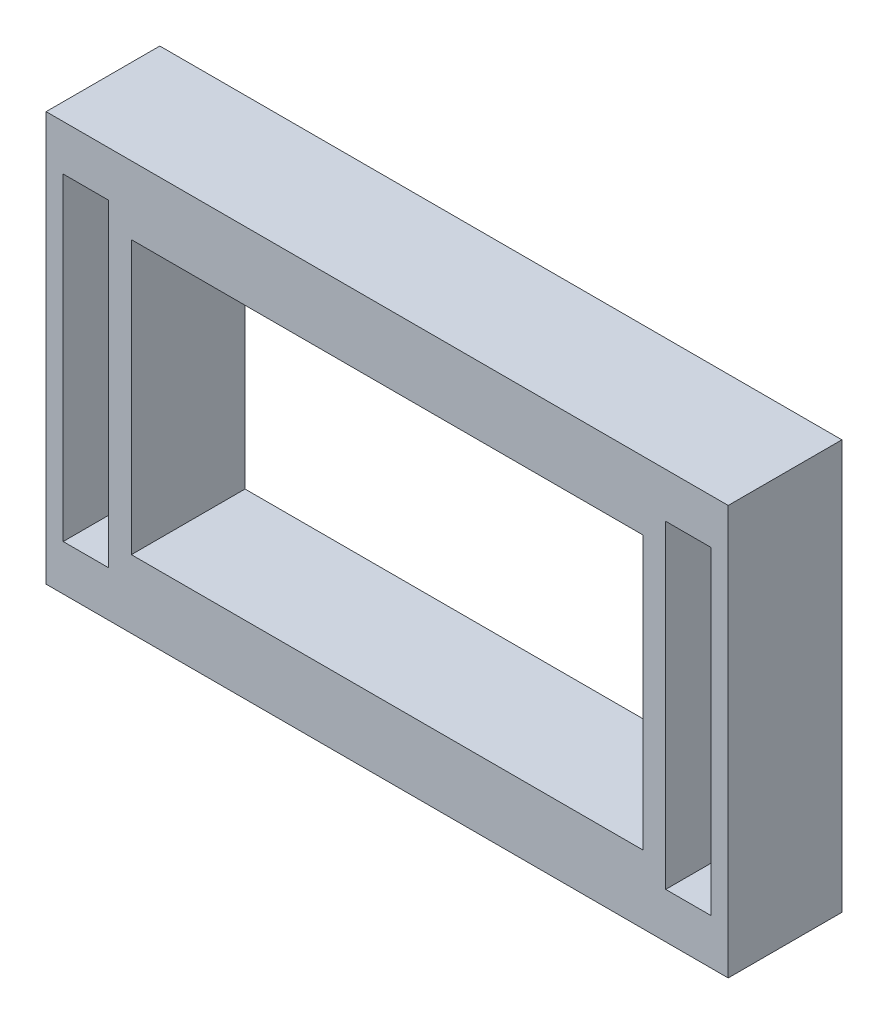
ISO-10303-21;
HEADER;
FILE_DESCRIPTION(('STEP AP214'),'2;1');
FILE_NAME('part.step','',(''),(''),'','','');
FILE_SCHEMA(('AUTOMOTIVE_DESIGN { 1 0 10303 214 1 1 1 1 }'));
ENDSEC;
DATA;
#1=APPLICATION_CONTEXT('core data for automotive mechanical design processes');
#2=APPLICATION_PROTOCOL_DEFINITION('international standard','automotive_design',2000,#1);
#3=PRODUCT_CONTEXT('',#1,'mechanical');
#4=PRODUCT('Part','Part','',(#3));
#5=PRODUCT_RELATED_PRODUCT_CATEGORY('part','',(#4));
#6=PRODUCT_DEFINITION_FORMATION('','',#4);
#7=PRODUCT_DEFINITION_CONTEXT('part definition',#1,'design');
#8=PRODUCT_DEFINITION('design','',#6,#7);
#9=PRODUCT_DEFINITION_SHAPE('','',#8);
#10=(LENGTH_UNIT() NAMED_UNIT(*) SI_UNIT(.MILLI.,.METRE.));
#11=(NAMED_UNIT(*) PLANE_ANGLE_UNIT() SI_UNIT($,.RADIAN.));
#12=(NAMED_UNIT(*) SI_UNIT($,.STERADIAN.) SOLID_ANGLE_UNIT());
#13=UNCERTAINTY_MEASURE_WITH_UNIT(LENGTH_MEASURE(1.E-05),#10,'distance_accuracy_value','');
#14=(GEOMETRIC_REPRESENTATION_CONTEXT(3) GLOBAL_UNCERTAINTY_ASSIGNED_CONTEXT((#13)) GLOBAL_UNIT_ASSIGNED_CONTEXT((#10,
#11,#12)) REPRESENTATION_CONTEXT('',''));
#15=CARTESIAN_POINT('',(0.,0.,0.));
#16=DIRECTION('',(0.,0.,1.));
#17=DIRECTION('',(1.,0.,0.));
#18=AXIS2_PLACEMENT_3D('',#15,#16,#17);
#19=CARTESIAN_POINT('',(0.,0.,5.));
#20=DIRECTION('',(0.,0.,1.));
#21=DIRECTION('',(1.,0.,0.));
#22=AXIS2_PLACEMENT_3D('',#19,#20,#21);
#23=PLANE('',#22);
#24=DIRECTION('',(0.,1.,0.));
#25=VECTOR('',#24,1.);
#26=CARTESIAN_POINT('',(-12.25,7.,5.));
#27=LINE('',#26,#25);
#28=CARTESIAN_POINT('',(-12.25,-7.,5.));
#29=VERTEX_POINT('',#28);
#30=CARTESIAN_POINT('',(-12.25,7.,5.));
#31=VERTEX_POINT('',#30);
#32=EDGE_CURVE('E49',#29,#31,#27,.T.);
#33=ORIENTED_EDGE('',*,*,#32,.F.);
#34=DIRECTION('',(1.,0.,0.));
#35=VECTOR('',#34,1.);
#36=CARTESIAN_POINT('',(-14.25,-7.,5.));
#37=LINE('',#36,#35);
#38=CARTESIAN_POINT('',(-14.25,-7.,5.));
#39=VERTEX_POINT('',#38);
#40=EDGE_CURVE('E167',#39,#29,#37,.T.);
#41=ORIENTED_EDGE('',*,*,#40,.F.);
#42=DIRECTION('',(0.,-1.,0.));
#43=VECTOR('',#42,1.);
#44=CARTESIAN_POINT('',(-14.25,7.,5.));
#45=LINE('',#44,#43);
#46=CARTESIAN_POINT('',(-14.25,7.,5.));
#47=VERTEX_POINT('',#46);
#48=EDGE_CURVE('E170',#47,#39,#45,.T.);
#49=ORIENTED_EDGE('',*,*,#48,.F.);
#50=DIRECTION('',(-1.,0.,0.));
#51=VECTOR('',#50,1.);
#52=CARTESIAN_POINT('',(-14.25,7.,5.));
#53=LINE('',#52,#51);
#54=EDGE_CURVE('E176',#31,#47,#53,.T.);
#55=ORIENTED_EDGE('',*,*,#54,.F.);
#56=EDGE_LOOP('',(#33,#41,#49,#55));
#57=FACE_BOUND('',#56,.T.);
#58=DIRECTION('',(0.,1.,0.));
#59=VECTOR('',#58,1.);
#60=CARTESIAN_POINT('',(14.25,7.02224410970977,5.));
#61=LINE('',#60,#59);
#62=CARTESIAN_POINT('',(14.25,-7.,5.));
#63=VERTEX_POINT('',#62);
#64=CARTESIAN_POINT('',(14.25,7.02224410970977,5.));
#65=VERTEX_POINT('',#64);
#66=EDGE_CURVE('E57',#63,#65,#61,.T.);
#67=ORIENTED_EDGE('',*,*,#66,.F.);
#68=DIRECTION('',(1.,0.,0.));
#69=VECTOR('',#68,1.);
#70=CARTESIAN_POINT('',(12.25,-7.,5.));
#71=LINE('',#70,#69);
#72=CARTESIAN_POINT('',(12.25,-7.,5.));
#73=VERTEX_POINT('',#72);
#74=EDGE_CURVE('E191',#73,#63,#71,.T.);
#75=ORIENTED_EDGE('',*,*,#74,.F.);
#76=DIRECTION('',(0.,-1.,0.));
#77=VECTOR('',#76,1.);
#78=CARTESIAN_POINT('',(12.25,7.02224410970977,5.));
#79=LINE('',#78,#77);
#80=CARTESIAN_POINT('',(12.25,7.02224410970977,5.));
#81=VERTEX_POINT('',#80);
#82=EDGE_CURVE('E205',#81,#73,#79,.T.);
#83=ORIENTED_EDGE('',*,*,#82,.F.);
#84=DIRECTION('',(-1.,0.,0.));
#85=VECTOR('',#84,1.);
#86=CARTESIAN_POINT('',(12.25,7.02224410970977,5.));
#87=LINE('',#86,#85);
#88=EDGE_CURVE('E202',#65,#81,#87,.T.);
#89=ORIENTED_EDGE('',*,*,#88,.F.);
#90=EDGE_LOOP('',(#67,#75,#83,#89));
#91=FACE_BOUND('',#90,.T.);
#92=DIRECTION('',(0.,1.,0.));
#93=VECTOR('',#92,1.);
#94=CARTESIAN_POINT('',(15.,9.,5.));
#95=LINE('',#94,#93);
#96=CARTESIAN_POINT('',(15.,-9.,5.));
#97=VERTEX_POINT('',#96);
#98=CARTESIAN_POINT('',(15.,9.,5.));
#99=VERTEX_POINT('',#98);
#100=EDGE_CURVE('E247',#97,#99,#95,.T.);
#101=ORIENTED_EDGE('',*,*,#100,.T.);
#102=DIRECTION('',(-1.,0.,0.));
#103=VECTOR('',#102,1.);
#104=CARTESIAN_POINT('',(-15.,9.,5.));
#105=LINE('',#104,#103);
#106=CARTESIAN_POINT('',(-15.,9.,5.));
#107=VERTEX_POINT('',#106);
#108=EDGE_CURVE('E250',#99,#107,#105,.T.);
#109=ORIENTED_EDGE('',*,*,#108,.T.);
#110=DIRECTION('',(0.,-1.,0.));
#111=VECTOR('',#110,1.);
#112=CARTESIAN_POINT('',(-15.,9.,5.));
#113=LINE('',#112,#111);
#114=CARTESIAN_POINT('',(-15.,-9.,5.));
#115=VERTEX_POINT('',#114);
#116=EDGE_CURVE('E253',#107,#115,#113,.T.);
#117=ORIENTED_EDGE('',*,*,#116,.T.);
#118=DIRECTION('',(1.,0.,0.));
#119=VECTOR('',#118,1.);
#120=CARTESIAN_POINT('',(-15.,-9.,5.));
#121=LINE('',#120,#119);
#122=EDGE_CURVE('E255',#115,#97,#121,.T.);
#123=ORIENTED_EDGE('',*,*,#122,.T.);
#124=EDGE_LOOP('',(#101,#109,#117,#123));
#125=FACE_BOUND('',#124,.T.);
#126=DIRECTION('',(-1.,0.,0.));
#127=VECTOR('',#126,1.);
#128=CARTESIAN_POINT('',(-11.25,6.,5.));
#129=LINE('',#128,#127);
#130=CARTESIAN_POINT('',(11.25,6.,5.));
#131=VERTEX_POINT('',#130);
#132=CARTESIAN_POINT('',(-11.25,6.,5.));
#133=VERTEX_POINT('',#132);
#134=EDGE_CURVE('E218',#131,#133,#129,.T.);
#135=ORIENTED_EDGE('',*,*,#134,.F.);
#136=DIRECTION('',(0.,1.,0.));
#137=VECTOR('',#136,1.);
#138=CARTESIAN_POINT('',(11.25,6.,5.));
#139=LINE('',#138,#137);
#140=CARTESIAN_POINT('',(11.25,-6.,5.));
#141=VERTEX_POINT('',#140);
#142=EDGE_CURVE('E216',#141,#131,#139,.T.);
#143=ORIENTED_EDGE('',*,*,#142,.F.);
#144=DIRECTION('',(1.,0.,0.));
#145=VECTOR('',#144,1.);
#146=CARTESIAN_POINT('',(-11.25,-6.,5.));
#147=LINE('',#146,#145);
#148=CARTESIAN_POINT('',(-11.25,-6.,5.));
#149=VERTEX_POINT('',#148);
#150=EDGE_CURVE('E224',#149,#141,#147,.T.);
#151=ORIENTED_EDGE('',*,*,#150,.F.);
#152=DIRECTION('',(0.,-1.,0.));
#153=VECTOR('',#152,1.);
#154=CARTESIAN_POINT('',(-11.25,6.,5.));
#155=LINE('',#154,#153);
#156=EDGE_CURVE('E221',#133,#149,#155,.T.);
#157=ORIENTED_EDGE('',*,*,#156,.F.);
#158=EDGE_LOOP('',(#135,#143,#151,#157));
#159=FACE_BOUND('',#158,.T.);
#160=ADVANCED_FACE('F34',(#57,#91,#125,#159),#23,.T.);
#161=CARTESIAN_POINT('',(0.,0.,0.));
#162=DIRECTION('',(0.,0.,1.));
#163=DIRECTION('',(1.,0.,0.));
#164=AXIS2_PLACEMENT_3D('',#161,#162,#163);
#165=PLANE('',#164);
#166=DIRECTION('',(0.,1.,0.));
#167=VECTOR('',#166,1.);
#168=CARTESIAN_POINT('',(15.,9.,0.));
#169=LINE('',#168,#167);
#170=CARTESIAN_POINT('',(15.,-9.,0.));
#171=VERTEX_POINT('',#170);
#172=CARTESIAN_POINT('',(15.,9.,0.));
#173=VERTEX_POINT('',#172);
#174=EDGE_CURVE('E246',#171,#173,#169,.T.);
#175=ORIENTED_EDGE('',*,*,#174,.F.);
#176=DIRECTION('',(1.,0.,0.));
#177=VECTOR('',#176,1.);
#178=CARTESIAN_POINT('',(-15.,-9.,0.));
#179=LINE('',#178,#177);
#180=CARTESIAN_POINT('',(-15.,-9.,0.));
#181=VERTEX_POINT('',#180);
#182=EDGE_CURVE('E251',#181,#171,#179,.T.);
#183=ORIENTED_EDGE('',*,*,#182,.F.);
#184=DIRECTION('',(0.,-1.,0.));
#185=VECTOR('',#184,1.);
#186=CARTESIAN_POINT('',(-15.,9.,0.));
#187=LINE('',#186,#185);
#188=CARTESIAN_POINT('',(-15.,9.,0.));
#189=VERTEX_POINT('',#188);
#190=EDGE_CURVE('E262',#189,#181,#187,.T.);
#191=ORIENTED_EDGE('',*,*,#190,.F.);
#192=DIRECTION('',(-1.,0.,0.));
#193=VECTOR('',#192,1.);
#194=CARTESIAN_POINT('',(-15.,9.,0.));
#195=LINE('',#194,#193);
#196=EDGE_CURVE('E260',#173,#189,#195,.T.);
#197=ORIENTED_EDGE('',*,*,#196,.F.);
#198=EDGE_LOOP('',(#175,#183,#191,#197));
#199=FACE_BOUND('',#198,.T.);
#200=DIRECTION('',(0.,1.,0.));
#201=VECTOR('',#200,1.);
#202=CARTESIAN_POINT('',(11.25,6.,0.));
#203=LINE('',#202,#201);
#204=CARTESIAN_POINT('',(11.25,-6.,0.));
#205=VERTEX_POINT('',#204);
#206=CARTESIAN_POINT('',(11.25,6.,0.));
#207=VERTEX_POINT('',#206);
#208=EDGE_CURVE('E183',#205,#207,#203,.T.);
#209=ORIENTED_EDGE('',*,*,#208,.T.);
#210=DIRECTION('',(-1.,0.,0.));
#211=VECTOR('',#210,1.);
#212=CARTESIAN_POINT('',(-11.25,6.,0.));
#213=LINE('',#212,#211);
#214=CARTESIAN_POINT('',(-11.25,6.,0.));
#215=VERTEX_POINT('',#214);
#216=EDGE_CURVE('E229',#207,#215,#213,.T.);
#217=ORIENTED_EDGE('',*,*,#216,.T.);
#218=DIRECTION('',(0.,-1.,0.));
#219=VECTOR('',#218,1.);
#220=CARTESIAN_POINT('',(-11.25,6.,0.));
#221=LINE('',#220,#219);
#222=CARTESIAN_POINT('',(-11.25,-6.,0.));
#223=VERTEX_POINT('',#222);
#224=EDGE_CURVE('E232',#215,#223,#221,.T.);
#225=ORIENTED_EDGE('',*,*,#224,.T.);
#226=DIRECTION('',(1.,0.,0.));
#227=VECTOR('',#226,1.);
#228=CARTESIAN_POINT('',(-11.25,-6.,0.));
#229=LINE('',#228,#227);
#230=EDGE_CURVE('E219',#223,#205,#229,.T.);
#231=ORIENTED_EDGE('',*,*,#230,.T.);
#232=EDGE_LOOP('',(#209,#217,#225,#231));
#233=FACE_BOUND('',#232,.T.);
#234=ADVANCED_FACE('F280',(#199,#233),#165,.F.);
#235=CARTESIAN_POINT('',(15.,9.,5.));
#236=DIRECTION('',(-1.,0.,0.));
#237=DIRECTION('',(0.,0.,1.));
#238=AXIS2_PLACEMENT_3D('',#235,#236,#237);
#239=PLANE('',#238);
#240=ORIENTED_EDGE('',*,*,#174,.T.);
#241=DIRECTION('',(0.,0.,-1.));
#242=VECTOR('',#241,1.);
#243=CARTESIAN_POINT('',(15.,9.,5.));
#244=LINE('',#243,#242);
#245=EDGE_CURVE('E11',#99,#173,#244,.T.);
#246=ORIENTED_EDGE('',*,*,#245,.F.);
#247=ORIENTED_EDGE('',*,*,#100,.F.);
#248=DIRECTION('',(0.,0.,-1.));
#249=VECTOR('',#248,1.);
#250=CARTESIAN_POINT('',(15.,-9.,5.));
#251=LINE('',#250,#249);
#252=EDGE_CURVE('E257',#97,#171,#251,.T.);
#253=ORIENTED_EDGE('',*,*,#252,.T.);
#254=EDGE_LOOP('',(#240,#246,#247,#253));
#255=FACE_BOUND('',#254,.T.);
#256=ADVANCED_FACE('F36',(#255),#239,.F.);
#257=CARTESIAN_POINT('',(-15.,9.,5.));
#258=DIRECTION('',(0.,-1.,0.));
#259=DIRECTION('',(0.,0.,-1.));
#260=AXIS2_PLACEMENT_3D('',#257,#258,#259);
#261=PLANE('',#260);
#262=ORIENTED_EDGE('',*,*,#196,.T.);
#263=DIRECTION('',(0.,0.,-1.));
#264=VECTOR('',#263,1.);
#265=CARTESIAN_POINT('',(-15.,9.,5.));
#266=LINE('',#265,#264);
#267=EDGE_CURVE('E42',#107,#189,#266,.T.);
#268=ORIENTED_EDGE('',*,*,#267,.F.);
#269=ORIENTED_EDGE('',*,*,#108,.F.);
#270=ORIENTED_EDGE('',*,*,#245,.T.);
#271=EDGE_LOOP('',(#262,#268,#269,#270));
#272=FACE_BOUND('',#271,.T.);
#273=ADVANCED_FACE('F291',(#272),#261,.F.);
#274=CARTESIAN_POINT('',(-15.,9.,5.));
#275=DIRECTION('',(1.,0.,0.));
#276=DIRECTION('',(0.,0.,-1.));
#277=AXIS2_PLACEMENT_3D('',#274,#275,#276);
#278=PLANE('',#277);
#279=ORIENTED_EDGE('',*,*,#190,.T.);
#280=DIRECTION('',(0.,0.,-1.));
#281=VECTOR('',#280,1.);
#282=CARTESIAN_POINT('',(-15.,-9.,5.));
#283=LINE('',#282,#281);
#284=EDGE_CURVE('E267',#115,#181,#283,.T.);
#285=ORIENTED_EDGE('',*,*,#284,.F.);
#286=ORIENTED_EDGE('',*,*,#116,.F.);
#287=ORIENTED_EDGE('',*,*,#267,.T.);
#288=EDGE_LOOP('',(#279,#285,#286,#287));
#289=FACE_BOUND('',#288,.T.);
#290=ADVANCED_FACE('F274',(#289),#278,.F.);
#291=CARTESIAN_POINT('',(-15.,-9.,5.));
#292=DIRECTION('',(0.,1.,0.));
#293=DIRECTION('',(0.,0.,1.));
#294=AXIS2_PLACEMENT_3D('',#291,#292,#293);
#295=PLANE('',#294);
#296=ORIENTED_EDGE('',*,*,#182,.T.);
#297=ORIENTED_EDGE('',*,*,#252,.F.);
#298=ORIENTED_EDGE('',*,*,#122,.F.);
#299=ORIENTED_EDGE('',*,*,#284,.T.);
#300=EDGE_LOOP('',(#296,#297,#298,#299));
#301=FACE_BOUND('',#300,.T.);
#302=ADVANCED_FACE('F284',(#301),#295,.F.);
#303=CARTESIAN_POINT('',(11.25,6.,5.));
#304=DIRECTION('',(-1.,0.,0.));
#305=DIRECTION('',(0.,0.,1.));
#306=AXIS2_PLACEMENT_3D('',#303,#304,#305);
#307=PLANE('',#306);
#308=ORIENTED_EDGE('',*,*,#208,.F.);
#309=DIRECTION('',(0.,0.,-1.));
#310=VECTOR('',#309,1.);
#311=CARTESIAN_POINT('',(11.25,-6.,5.));
#312=LINE('',#311,#310);
#313=EDGE_CURVE('E226',#141,#205,#312,.T.);
#314=ORIENTED_EDGE('',*,*,#313,.F.);
#315=ORIENTED_EDGE('',*,*,#142,.T.);
#316=DIRECTION('',(0.,0.,-1.));
#317=VECTOR('',#316,1.);
#318=CARTESIAN_POINT('',(11.25,6.,5.));
#319=LINE('',#318,#317);
#320=EDGE_CURVE('E243',#131,#207,#319,.T.);
#321=ORIENTED_EDGE('',*,*,#320,.T.);
#322=EDGE_LOOP('',(#308,#314,#315,#321));
#323=FACE_BOUND('',#322,.T.);
#324=ADVANCED_FACE('F307',(#323),#307,.T.);
#325=CARTESIAN_POINT('',(-11.25,6.,5.));
#326=DIRECTION('',(0.,-1.,0.));
#327=DIRECTION('',(0.,0.,-1.));
#328=AXIS2_PLACEMENT_3D('',#325,#326,#327);
#329=PLANE('',#328);
#330=ORIENTED_EDGE('',*,*,#216,.F.);
#331=ORIENTED_EDGE('',*,*,#320,.F.);
#332=ORIENTED_EDGE('',*,*,#134,.T.);
#333=DIRECTION('',(0.,0.,-1.));
#334=VECTOR('',#333,1.);
#335=CARTESIAN_POINT('',(-11.25,6.,5.));
#336=LINE('',#335,#334);
#337=EDGE_CURVE('E241',#133,#215,#336,.T.);
#338=ORIENTED_EDGE('',*,*,#337,.T.);
#339=EDGE_LOOP('',(#330,#331,#332,#338));
#340=FACE_BOUND('',#339,.T.);
#341=ADVANCED_FACE('F314',(#340),#329,.T.);
#342=CARTESIAN_POINT('',(-11.25,6.,5.));
#343=DIRECTION('',(1.,0.,0.));
#344=DIRECTION('',(0.,0.,-1.));
#345=AXIS2_PLACEMENT_3D('',#342,#343,#344);
#346=PLANE('',#345);
#347=ORIENTED_EDGE('',*,*,#224,.F.);
#348=ORIENTED_EDGE('',*,*,#337,.F.);
#349=ORIENTED_EDGE('',*,*,#156,.T.);
#350=DIRECTION('',(0.,0.,-1.));
#351=VECTOR('',#350,1.);
#352=CARTESIAN_POINT('',(-11.25,-6.,5.));
#353=LINE('',#352,#351);
#354=EDGE_CURVE('E239',#149,#223,#353,.T.);
#355=ORIENTED_EDGE('',*,*,#354,.T.);
#356=EDGE_LOOP('',(#347,#348,#349,#355));
#357=FACE_BOUND('',#356,.T.);
#358=ADVANCED_FACE('F319',(#357),#346,.T.);
#359=CARTESIAN_POINT('',(-11.25,-6.,5.));
#360=DIRECTION('',(0.,1.,0.));
#361=DIRECTION('',(0.,0.,1.));
#362=AXIS2_PLACEMENT_3D('',#359,#360,#361);
#363=PLANE('',#362);
#364=ORIENTED_EDGE('',*,*,#230,.F.);
#365=ORIENTED_EDGE('',*,*,#354,.F.);
#366=ORIENTED_EDGE('',*,*,#150,.T.);
#367=ORIENTED_EDGE('',*,*,#313,.T.);
#368=EDGE_LOOP('',(#364,#365,#366,#367));
#369=FACE_BOUND('',#368,.T.);
#370=ADVANCED_FACE('F326',(#369),#363,.T.);
#371=CARTESIAN_POINT('',(14.25,7.02224410970977,1.));
#372=DIRECTION('',(1.,0.,0.));
#373=DIRECTION('',(0.,1.,0.));
#374=AXIS2_PLACEMENT_3D('',#371,#372,#373);
#375=PLANE('',#374);
#376=ORIENTED_EDGE('',*,*,#66,.T.);
#377=DIRECTION('',(0.,0.,1.));
#378=VECTOR('',#377,1.);
#379=CARTESIAN_POINT('',(14.25,7.02224410970977,1.));
#380=LINE('',#379,#378);
#381=CARTESIAN_POINT('',(14.25,7.02224410970977,1.));
#382=VERTEX_POINT('',#381);
#383=EDGE_CURVE('E200',#382,#65,#380,.T.);
#384=ORIENTED_EDGE('',*,*,#383,.F.);
#385=DIRECTION('',(0.,1.,0.));
#386=VECTOR('',#385,1.);
#387=CARTESIAN_POINT('',(14.25,7.02224410970977,1.));
#388=LINE('',#387,#386);
#389=CARTESIAN_POINT('',(14.25,-7.,1.));
#390=VERTEX_POINT('',#389);
#391=EDGE_CURVE('E187',#390,#382,#388,.T.);
#392=ORIENTED_EDGE('',*,*,#391,.F.);
#393=DIRECTION('',(0.,0.,1.));
#394=VECTOR('',#393,1.);
#395=CARTESIAN_POINT('',(14.25,-7.,1.));
#396=LINE('',#395,#394);
#397=EDGE_CURVE('E177',#390,#63,#396,.T.);
#398=ORIENTED_EDGE('',*,*,#397,.T.);
#399=EDGE_LOOP('',(#376,#384,#392,#398));
#400=FACE_BOUND('',#399,.T.);
#401=ADVANCED_FACE('F338',(#400),#375,.F.);
#402=CARTESIAN_POINT('',(12.25,-7.,1.));
#403=DIRECTION('',(0.,-1.,0.));
#404=DIRECTION('',(0.,0.,-1.));
#405=AXIS2_PLACEMENT_3D('',#402,#403,#404);
#406=PLANE('',#405);
#407=ORIENTED_EDGE('',*,*,#74,.T.);
#408=ORIENTED_EDGE('',*,*,#397,.F.);
#409=DIRECTION('',(1.,0.,0.));
#410=VECTOR('',#409,1.);
#411=CARTESIAN_POINT('',(12.25,-7.,1.));
#412=LINE('',#411,#410);
#413=CARTESIAN_POINT('',(12.25,-7.,1.));
#414=VERTEX_POINT('',#413);
#415=EDGE_CURVE('E197',#414,#390,#412,.T.);
#416=ORIENTED_EDGE('',*,*,#415,.F.);
#417=DIRECTION('',(0.,0.,1.));
#418=VECTOR('',#417,1.);
#419=CARTESIAN_POINT('',(12.25,-7.,1.));
#420=LINE('',#419,#418);
#421=EDGE_CURVE('E211',#414,#73,#420,.T.);
#422=ORIENTED_EDGE('',*,*,#421,.T.);
#423=EDGE_LOOP('',(#407,#408,#416,#422));
#424=FACE_BOUND('',#423,.T.);
#425=ADVANCED_FACE('F343',(#424),#406,.F.);
#426=CARTESIAN_POINT('',(12.25,7.02224410970977,1.));
#427=DIRECTION('',(-1.,0.,0.));
#428=DIRECTION('',(0.,-1.,0.));
#429=AXIS2_PLACEMENT_3D('',#426,#427,#428);
#430=PLANE('',#429);
#431=ORIENTED_EDGE('',*,*,#82,.T.);
#432=ORIENTED_EDGE('',*,*,#421,.F.);
#433=DIRECTION('',(0.,-1.,0.));
#434=VECTOR('',#433,1.);
#435=CARTESIAN_POINT('',(12.25,7.02224410970977,1.));
#436=LINE('',#435,#434);
#437=CARTESIAN_POINT('',(12.25,7.02224410970977,1.));
#438=VERTEX_POINT('',#437);
#439=EDGE_CURVE('E194',#438,#414,#436,.T.);
#440=ORIENTED_EDGE('',*,*,#439,.F.);
#441=DIRECTION('',(0.,0.,1.));
#442=VECTOR('',#441,1.);
#443=CARTESIAN_POINT('',(12.25,7.02224410970977,1.));
#444=LINE('',#443,#442);
#445=EDGE_CURVE('E213',#438,#81,#444,.T.);
#446=ORIENTED_EDGE('',*,*,#445,.T.);
#447=EDGE_LOOP('',(#431,#432,#440,#446));
#448=FACE_BOUND('',#447,.T.);
#449=ADVANCED_FACE('F348',(#448),#430,.F.);
#450=CARTESIAN_POINT('',(12.25,7.02224410970977,1.));
#451=DIRECTION('',(0.,1.,0.));
#452=DIRECTION('',(0.,0.,1.));
#453=AXIS2_PLACEMENT_3D('',#450,#451,#452);
#454=PLANE('',#453);
#455=ORIENTED_EDGE('',*,*,#88,.T.);
#456=ORIENTED_EDGE('',*,*,#445,.F.);
#457=DIRECTION('',(-1.,0.,0.));
#458=VECTOR('',#457,1.);
#459=CARTESIAN_POINT('',(12.25,7.02224410970977,1.));
#460=LINE('',#459,#458);
#461=EDGE_CURVE('E190',#382,#438,#460,.T.);
#462=ORIENTED_EDGE('',*,*,#461,.F.);
#463=ORIENTED_EDGE('',*,*,#383,.T.);
#464=EDGE_LOOP('',(#455,#456,#462,#463));
#465=FACE_BOUND('',#464,.T.);
#466=ADVANCED_FACE('F344',(#465),#454,.F.);
#467=CARTESIAN_POINT('',(0.,0.,1.));
#468=DIRECTION('',(0.,0.,1.));
#469=DIRECTION('',(1.,0.,0.));
#470=AXIS2_PLACEMENT_3D('',#467,#468,#469);
#471=PLANE('',#470);
#472=ORIENTED_EDGE('',*,*,#391,.T.);
#473=ORIENTED_EDGE('',*,*,#461,.T.);
#474=ORIENTED_EDGE('',*,*,#439,.T.);
#475=ORIENTED_EDGE('',*,*,#415,.T.);
#476=EDGE_LOOP('',(#472,#473,#474,#475));
#477=FACE_BOUND('',#476,.T.);
#478=ADVANCED_FACE('F347',(#477),#471,.T.);
#479=CARTESIAN_POINT('',(-12.25,7.,1.));
#480=DIRECTION('',(1.,0.,0.));
#481=DIRECTION('',(0.,1.,0.));
#482=AXIS2_PLACEMENT_3D('',#479,#480,#481);
#483=PLANE('',#482);
#484=ORIENTED_EDGE('',*,*,#32,.T.);
#485=DIRECTION('',(0.,0.,1.));
#486=VECTOR('',#485,1.);
#487=CARTESIAN_POINT('',(-12.25,7.,1.));
#488=LINE('',#487,#486);
#489=CARTESIAN_POINT('',(-12.25,7.,1.));
#490=VERTEX_POINT('',#489);
#491=EDGE_CURVE('E145',#490,#31,#488,.T.);
#492=ORIENTED_EDGE('',*,*,#491,.F.);
#493=DIRECTION('',(0.,1.,0.));
#494=VECTOR('',#493,1.);
#495=CARTESIAN_POINT('',(-12.25,7.,1.));
#496=LINE('',#495,#494);
#497=CARTESIAN_POINT('',(-12.25,-7.,1.));
#498=VERTEX_POINT('',#497);
#499=EDGE_CURVE('E149',#498,#490,#496,.T.);
#500=ORIENTED_EDGE('',*,*,#499,.F.);
#501=DIRECTION('',(0.,0.,1.));
#502=VECTOR('',#501,1.);
#503=CARTESIAN_POINT('',(-12.25,-7.,1.));
#504=LINE('',#503,#502);
#505=EDGE_CURVE('E181',#498,#29,#504,.T.);
#506=ORIENTED_EDGE('',*,*,#505,.T.);
#507=EDGE_LOOP('',(#484,#492,#500,#506));
#508=FACE_BOUND('',#507,.T.);
#509=ADVANCED_FACE('F147',(#508),#483,.F.);
#510=CARTESIAN_POINT('',(-14.25,-7.,1.));
#511=DIRECTION('',(0.,-1.,0.));
#512=DIRECTION('',(0.,0.,-1.));
#513=AXIS2_PLACEMENT_3D('',#510,#511,#512);
#514=PLANE('',#513);
#515=ORIENTED_EDGE('',*,*,#40,.T.);
#516=ORIENTED_EDGE('',*,*,#505,.F.);
#517=DIRECTION('',(1.,0.,0.));
#518=VECTOR('',#517,1.);
#519=CARTESIAN_POINT('',(-14.25,-7.,1.));
#520=LINE('',#519,#518);
#521=CARTESIAN_POINT('',(-14.25,-7.,1.));
#522=VERTEX_POINT('',#521);
#523=EDGE_CURVE('E155',#522,#498,#520,.T.);
#524=ORIENTED_EDGE('',*,*,#523,.F.);
#525=DIRECTION('',(0.,0.,1.));
#526=VECTOR('',#525,1.);
#527=CARTESIAN_POINT('',(-14.25,-7.,1.));
#528=LINE('',#527,#526);
#529=EDGE_CURVE('E184',#522,#39,#528,.T.);
#530=ORIENTED_EDGE('',*,*,#529,.T.);
#531=EDGE_LOOP('',(#515,#516,#524,#530));
#532=FACE_BOUND('',#531,.T.);
#533=ADVANCED_FACE('F361',(#532),#514,.F.);
#534=CARTESIAN_POINT('',(-14.25,7.,1.));
#535=DIRECTION('',(-1.,0.,0.));
#536=DIRECTION('',(0.,-1.,0.));
#537=AXIS2_PLACEMENT_3D('',#534,#535,#536);
#538=PLANE('',#537);
#539=ORIENTED_EDGE('',*,*,#48,.T.);
#540=ORIENTED_EDGE('',*,*,#529,.F.);
#541=DIRECTION('',(0.,-1.,0.));
#542=VECTOR('',#541,1.);
#543=CARTESIAN_POINT('',(-14.25,7.,1.));
#544=LINE('',#543,#542);
#545=CARTESIAN_POINT('',(-14.25,7.,1.));
#546=VERTEX_POINT('',#545);
#547=EDGE_CURVE('E163',#546,#522,#544,.T.);
#548=ORIENTED_EDGE('',*,*,#547,.F.);
#549=DIRECTION('',(0.,0.,1.));
#550=VECTOR('',#549,1.);
#551=CARTESIAN_POINT('',(-14.25,7.,1.));
#552=LINE('',#551,#550);
#553=EDGE_CURVE('E154',#546,#47,#552,.T.);
#554=ORIENTED_EDGE('',*,*,#553,.T.);
#555=EDGE_LOOP('',(#539,#540,#548,#554));
#556=FACE_BOUND('',#555,.T.);
#557=ADVANCED_FACE('F364',(#556),#538,.F.);
#558=CARTESIAN_POINT('',(-14.25,7.,1.));
#559=DIRECTION('',(0.,1.,0.));
#560=DIRECTION('',(0.,0.,1.));
#561=AXIS2_PLACEMENT_3D('',#558,#559,#560);
#562=PLANE('',#561);
#563=ORIENTED_EDGE('',*,*,#54,.T.);
#564=ORIENTED_EDGE('',*,*,#553,.F.);
#565=DIRECTION('',(-1.,0.,0.));
#566=VECTOR('',#565,1.);
#567=CARTESIAN_POINT('',(-14.25,7.,1.));
#568=LINE('',#567,#566);
#569=EDGE_CURVE('E158',#490,#546,#568,.T.);
#570=ORIENTED_EDGE('',*,*,#569,.F.);
#571=ORIENTED_EDGE('',*,*,#491,.T.);
#572=EDGE_LOOP('',(#563,#564,#570,#571));
#573=FACE_BOUND('',#572,.T.);
#574=ADVANCED_FACE('F159',(#573),#562,.F.);
#575=CARTESIAN_POINT('',(0.,0.,1.));
#576=DIRECTION('',(0.,0.,1.));
#577=DIRECTION('',(1.,0.,0.));
#578=AXIS2_PLACEMENT_3D('',#575,#576,#577);
#579=PLANE('',#578);
#580=ORIENTED_EDGE('',*,*,#499,.T.);
#581=ORIENTED_EDGE('',*,*,#569,.T.);
#582=ORIENTED_EDGE('',*,*,#547,.T.);
#583=ORIENTED_EDGE('',*,*,#523,.T.);
#584=EDGE_LOOP('',(#580,#581,#582,#583));
#585=FACE_BOUND('',#584,.T.);
#586=ADVANCED_FACE('F165',(#585),#579,.T.);
#587=CLOSED_SHELL('',(#160,#234,#256,#273,#290,#302,#324,#341,#358,#370,#401,#425,#449,#466,
#478,#509,#533,#557,#574,#586));
#588=MANIFOLD_SOLID_BREP('B2',#587);
#589=ADVANCED_BREP_SHAPE_REPRESENTATION('',(#18,#588),#14);
#590=SHAPE_DEFINITION_REPRESENTATION(#9,#589);
ENDSEC;
END-ISO-10303-21;
